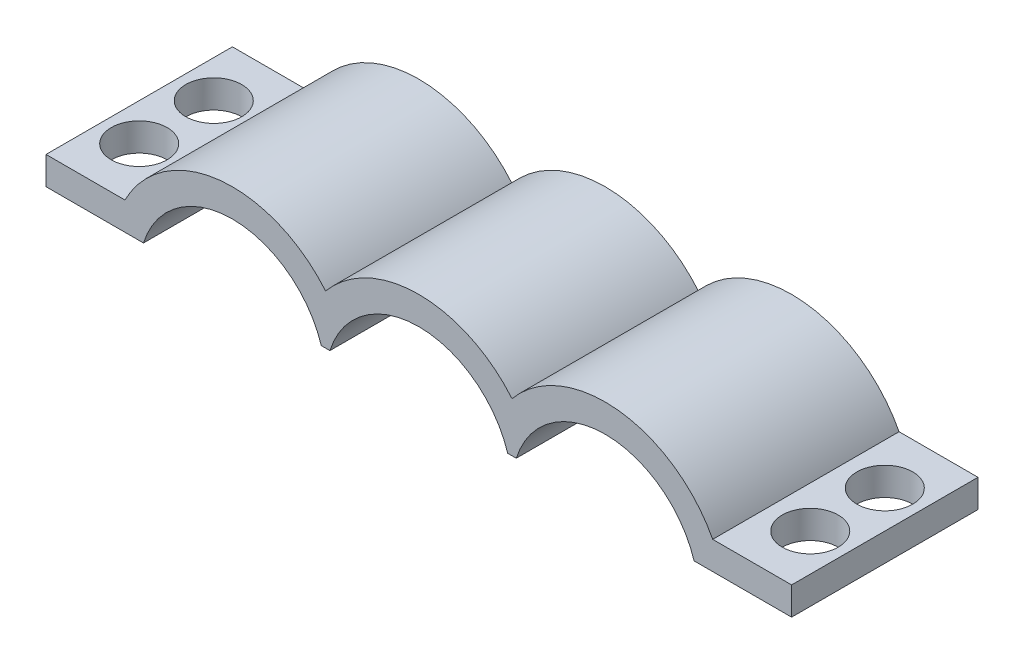
ISO-10303-21;
HEADER;
FILE_DESCRIPTION(('STEP AP214'),'2;1');
FILE_NAME('part.step','',(''),(''),'','','');
FILE_SCHEMA(('AUTOMOTIVE_DESIGN { 1 0 10303 214 1 1 1 1 }'));
ENDSEC;
DATA;
#1=APPLICATION_CONTEXT('core data for automotive mechanical design processes');
#2=APPLICATION_PROTOCOL_DEFINITION('international standard','automotive_design',2000,#1);
#3=PRODUCT_CONTEXT('',#1,'mechanical');
#4=PRODUCT('Part','Part','',(#3));
#5=PRODUCT_RELATED_PRODUCT_CATEGORY('part','',(#4));
#6=PRODUCT_DEFINITION_FORMATION('','',#4);
#7=PRODUCT_DEFINITION_CONTEXT('part definition',#1,'design');
#8=PRODUCT_DEFINITION('design','',#6,#7);
#9=PRODUCT_DEFINITION_SHAPE('','',#8);
#10=(LENGTH_UNIT() NAMED_UNIT(*) SI_UNIT(.MILLI.,.METRE.));
#11=(NAMED_UNIT(*) PLANE_ANGLE_UNIT() SI_UNIT($,.RADIAN.));
#12=(NAMED_UNIT(*) SI_UNIT($,.STERADIAN.) SOLID_ANGLE_UNIT());
#13=UNCERTAINTY_MEASURE_WITH_UNIT(LENGTH_MEASURE(1.E-05),#10,'distance_accuracy_value','');
#14=(GEOMETRIC_REPRESENTATION_CONTEXT(3) GLOBAL_UNCERTAINTY_ASSIGNED_CONTEXT((#13)) GLOBAL_UNIT_ASSIGNED_CONTEXT((#10,
#11,#12)) REPRESENTATION_CONTEXT('',''));
#15=CARTESIAN_POINT('',(0.,0.,0.));
#16=DIRECTION('',(0.,0.,1.));
#17=DIRECTION('',(1.,0.,0.));
#18=AXIS2_PLACEMENT_3D('',#15,#16,#17);
#19=CARTESIAN_POINT('',(20.,3.,10.));
#20=DIRECTION('',(0.,-1.,0.));
#21=DIRECTION('',(0.,0.,-1.));
#22=AXIS2_PLACEMENT_3D('',#19,#20,#21);
#23=PLANE('',#22);
#24=CARTESIAN_POINT('',(18.,3.,2.99999999999978));
#25=DIRECTION('',(0.,1.,0.));
#26=DIRECTION('',(0.,0.,-1.));
#27=AXIS2_PLACEMENT_3D('',#24,#25,#26);
#28=CIRCLE('',#27,1.5);
#29=CARTESIAN_POINT('',(18.,3.,1.49999999999978));
#30=VERTEX_POINT('',#29);
#31=EDGE_CURVE('E268',#30,#30,#28,.T.);
#32=ORIENTED_EDGE('',*,*,#31,.F.);
#33=EDGE_LOOP('',(#32));
#34=FACE_BOUND('',#33,.T.);
#35=CARTESIAN_POINT('',(18.,3.,6.99999999999978));
#36=DIRECTION('',(0.,1.,0.));
#37=DIRECTION('',(0.,0.,1.));
#38=AXIS2_PLACEMENT_3D('',#35,#36,#37);
#39=CIRCLE('',#38,1.49999999999999);
#40=CARTESIAN_POINT('',(18.,3.,8.49999999999977));
#41=VERTEX_POINT('',#40);
#42=EDGE_CURVE('E272',#41,#41,#39,.T.);
#43=ORIENTED_EDGE('',*,*,#42,.F.);
#44=EDGE_LOOP('',(#43));
#45=FACE_BOUND('',#44,.T.);
#46=DIRECTION('',(-1.,0.,0.));
#47=VECTOR('',#46,1.);
#48=CARTESIAN_POINT('',(20.,3.,0.));
#49=LINE('',#48,#47);
#50=CARTESIAN_POINT('',(20.,3.,0.));
#51=VERTEX_POINT('',#50);
#52=CARTESIAN_POINT('',(15.7662812973354,3.,0.));
#53=VERTEX_POINT('',#52);
#54=EDGE_CURVE('E174',#51,#53,#49,.T.);
#55=ORIENTED_EDGE('',*,*,#54,.T.);
#56=DIRECTION('',(0.,0.,-1.));
#57=VECTOR('',#56,1.);
#58=CARTESIAN_POINT('',(15.7662812973354,3.,10.));
#59=LINE('',#58,#57);
#60=CARTESIAN_POINT('',(15.7662812973354,3.,10.));
#61=VERTEX_POINT('',#60);
#62=EDGE_CURVE('E11',#61,#53,#59,.T.);
#63=ORIENTED_EDGE('',*,*,#62,.F.);
#64=DIRECTION('',(-1.,0.,0.));
#65=VECTOR('',#64,1.);
#66=CARTESIAN_POINT('',(20.,3.,10.));
#67=LINE('',#66,#65);
#68=CARTESIAN_POINT('',(20.,3.,10.));
#69=VERTEX_POINT('',#68);
#70=EDGE_CURVE('E200',#69,#61,#67,.T.);
#71=ORIENTED_EDGE('',*,*,#70,.F.);
#72=DIRECTION('',(0.,0.,-1.));
#73=VECTOR('',#72,1.);
#74=CARTESIAN_POINT('',(20.,3.,10.));
#75=LINE('',#74,#73);
#76=EDGE_CURVE('E170',#69,#51,#75,.T.);
#77=ORIENTED_EDGE('',*,*,#76,.T.);
#78=EDGE_LOOP('',(#55,#63,#71,#77));
#79=FACE_BOUND('',#78,.T.);
#80=ADVANCED_FACE('F40',(#34,#45,#79),#23,.F.);
#81=CARTESIAN_POINT('',(10.,0.,10.));
#82=DIRECTION('',(0.,0.,-1.));
#83=DIRECTION('',(-1.,0.,0.));
#84=AXIS2_PLACEMENT_3D('',#81,#82,#83);
#85=CYLINDRICAL_SURFACE('',#84,6.49999999999999);
#86=CARTESIAN_POINT('',(10.,0.,0.));
#87=DIRECTION('',(0.,0.,1.));
#88=DIRECTION('',(1.,0.,0.));
#89=AXIS2_PLACEMENT_3D('',#86,#87,#88);
#90=CIRCLE('',#89,6.49999999999999);
#91=CARTESIAN_POINT('',(5.,4.15331193145904,0.));
#92=VERTEX_POINT('',#91);
#93=EDGE_CURVE('E177',#53,#92,#90,.T.);
#94=ORIENTED_EDGE('',*,*,#93,.T.);
#95=DIRECTION('',(0.,0.,-1.));
#96=VECTOR('',#95,1.);
#97=CARTESIAN_POINT('',(5.,4.15331193145904,10.));
#98=LINE('',#97,#96);
#99=CARTESIAN_POINT('',(5.,4.15331193145904,10.));
#100=VERTEX_POINT('',#99);
#101=EDGE_CURVE('E49',#100,#92,#98,.T.);
#102=ORIENTED_EDGE('',*,*,#101,.F.);
#103=CARTESIAN_POINT('',(10.,0.,10.));
#104=DIRECTION('',(0.,0.,1.));
#105=DIRECTION('',(1.,0.,0.));
#106=AXIS2_PLACEMENT_3D('',#103,#104,#105);
#107=CIRCLE('',#106,6.49999999999999);
#108=EDGE_CURVE('E119',#61,#100,#107,.T.);
#109=ORIENTED_EDGE('',*,*,#108,.F.);
#110=ORIENTED_EDGE('',*,*,#62,.T.);
#111=EDGE_LOOP('',(#94,#102,#109,#110));
#112=FACE_BOUND('',#111,.T.);
#113=ADVANCED_FACE('F259',(#112),#85,.T.);
#114=CARTESIAN_POINT('',(0.,0.,10.));
#115=DIRECTION('',(0.,0.,-1.));
#116=DIRECTION('',(-1.,0.,0.));
#117=AXIS2_PLACEMENT_3D('',#114,#115,#116);
#118=CYLINDRICAL_SURFACE('',#117,6.5);
#119=CARTESIAN_POINT('',(0.,0.,0.));
#120=DIRECTION('',(0.,0.,1.));
#121=DIRECTION('',(1.,0.,0.));
#122=AXIS2_PLACEMENT_3D('',#119,#120,#121);
#123=CIRCLE('',#122,6.5);
#124=CARTESIAN_POINT('',(-5.,4.15331193145904,0.));
#125=VERTEX_POINT('',#124);
#126=EDGE_CURVE('E179',#92,#125,#123,.T.);
#127=ORIENTED_EDGE('',*,*,#126,.T.);
#128=DIRECTION('',(0.,0.,-1.));
#129=VECTOR('',#128,1.);
#130=CARTESIAN_POINT('',(-5.,4.15331193145904,10.));
#131=LINE('',#130,#129);
#132=CARTESIAN_POINT('',(-5.,4.15331193145904,10.));
#133=VERTEX_POINT('',#132);
#134=EDGE_CURVE('E225',#133,#125,#131,.T.);
#135=ORIENTED_EDGE('',*,*,#134,.F.);
#136=CARTESIAN_POINT('',(0.,0.,10.));
#137=DIRECTION('',(0.,0.,1.));
#138=DIRECTION('',(1.,0.,0.));
#139=AXIS2_PLACEMENT_3D('',#136,#137,#138);
#140=CIRCLE('',#139,6.5);
#141=EDGE_CURVE('E283',#100,#133,#140,.T.);
#142=ORIENTED_EDGE('',*,*,#141,.F.);
#143=ORIENTED_EDGE('',*,*,#101,.T.);
#144=EDGE_LOOP('',(#127,#135,#142,#143));
#145=FACE_BOUND('',#144,.T.);
#146=ADVANCED_FACE('F264',(#145),#118,.T.);
#147=CARTESIAN_POINT('',(-10.,0.,10.));
#148=DIRECTION('',(0.,0.,-1.));
#149=DIRECTION('',(-1.,0.,0.));
#150=AXIS2_PLACEMENT_3D('',#147,#148,#149);
#151=CYLINDRICAL_SURFACE('',#150,6.5);
#152=CARTESIAN_POINT('',(-10.,0.,0.));
#153=DIRECTION('',(0.,0.,1.));
#154=DIRECTION('',(1.,0.,0.));
#155=AXIS2_PLACEMENT_3D('',#152,#153,#154);
#156=CIRCLE('',#155,6.5);
#157=CARTESIAN_POINT('',(-15.7662812973354,3.,0.));
#158=VERTEX_POINT('',#157);
#159=EDGE_CURVE('E181',#125,#158,#156,.T.);
#160=ORIENTED_EDGE('',*,*,#159,.T.);
#161=DIRECTION('',(0.,0.,-1.));
#162=VECTOR('',#161,1.);
#163=CARTESIAN_POINT('',(-15.7662812973354,3.,10.));
#164=LINE('',#163,#162);
#165=CARTESIAN_POINT('',(-15.7662812973354,3.,10.));
#166=VERTEX_POINT('',#165);
#167=EDGE_CURVE('E222',#166,#158,#164,.T.);
#168=ORIENTED_EDGE('',*,*,#167,.F.);
#169=CARTESIAN_POINT('',(-10.,0.,10.));
#170=DIRECTION('',(0.,0.,1.));
#171=DIRECTION('',(1.,0.,0.));
#172=AXIS2_PLACEMENT_3D('',#169,#170,#171);
#173=CIRCLE('',#172,6.5);
#174=EDGE_CURVE('E285',#133,#166,#173,.T.);
#175=ORIENTED_EDGE('',*,*,#174,.F.);
#176=ORIENTED_EDGE('',*,*,#134,.T.);
#177=EDGE_LOOP('',(#160,#168,#175,#176));
#178=FACE_BOUND('',#177,.T.);
#179=ADVANCED_FACE('F336',(#178),#151,.T.);
#180=CARTESIAN_POINT('',(-20.,3.,10.));
#181=DIRECTION('',(0.,-1.,0.));
#182=DIRECTION('',(0.,0.,-1.));
#183=AXIS2_PLACEMENT_3D('',#180,#181,#182);
#184=PLANE('',#183);
#185=CARTESIAN_POINT('',(-18.,3.,7.));
#186=DIRECTION('',(0.,1.,0.));
#187=DIRECTION('',(0.,0.,-1.));
#188=AXIS2_PLACEMENT_3D('',#185,#186,#187);
#189=CIRCLE('',#188,1.5);
#190=CARTESIAN_POINT('',(-18.,3.,5.5));
#191=VERTEX_POINT('',#190);
#192=EDGE_CURVE('E381',#191,#191,#189,.T.);
#193=ORIENTED_EDGE('',*,*,#192,.F.);
#194=EDGE_LOOP('',(#193));
#195=FACE_BOUND('',#194,.T.);
#196=CARTESIAN_POINT('',(-18.,3.,3.));
#197=DIRECTION('',(0.,1.,0.));
#198=DIRECTION('',(0.,0.,1.));
#199=AXIS2_PLACEMENT_3D('',#196,#197,#198);
#200=CIRCLE('',#199,1.5);
#201=CARTESIAN_POINT('',(-18.,3.,4.5));
#202=VERTEX_POINT('',#201);
#203=EDGE_CURVE('E234',#202,#202,#200,.T.);
#204=ORIENTED_EDGE('',*,*,#203,.F.);
#205=EDGE_LOOP('',(#204));
#206=FACE_BOUND('',#205,.T.);
#207=DIRECTION('',(-1.,0.,0.));
#208=VECTOR('',#207,1.);
#209=CARTESIAN_POINT('',(-20.,3.,0.));
#210=LINE('',#209,#208);
#211=CARTESIAN_POINT('',(-20.,3.,0.));
#212=VERTEX_POINT('',#211);
#213=EDGE_CURVE('E183',#158,#212,#210,.T.);
#214=ORIENTED_EDGE('',*,*,#213,.T.);
#215=DIRECTION('',(0.,0.,-1.));
#216=VECTOR('',#215,1.);
#217=CARTESIAN_POINT('',(-20.,3.,10.));
#218=LINE('',#217,#216);
#219=CARTESIAN_POINT('',(-20.,3.,10.));
#220=VERTEX_POINT('',#219);
#221=EDGE_CURVE('E219',#220,#212,#218,.T.);
#222=ORIENTED_EDGE('',*,*,#221,.F.);
#223=DIRECTION('',(-1.,0.,0.));
#224=VECTOR('',#223,1.);
#225=CARTESIAN_POINT('',(-20.,3.,10.));
#226=LINE('',#225,#224);
#227=EDGE_CURVE('E287',#166,#220,#226,.T.);
#228=ORIENTED_EDGE('',*,*,#227,.F.);
#229=ORIENTED_EDGE('',*,*,#167,.T.);
#230=EDGE_LOOP('',(#214,#222,#228,#229));
#231=FACE_BOUND('',#230,.T.);
#232=ADVANCED_FACE('F333',(#195,#206,#231),#184,.F.);
#233=CARTESIAN_POINT('',(-20.,1.5,10.));
#234=DIRECTION('',(1.,0.,0.));
#235=DIRECTION('',(0.,1.,0.));
#236=AXIS2_PLACEMENT_3D('',#233,#234,#235);
#237=PLANE('',#236);
#238=DIRECTION('',(0.,-1.,0.));
#239=VECTOR('',#238,1.);
#240=CARTESIAN_POINT('',(-20.,1.5,0.));
#241=LINE('',#240,#239);
#242=CARTESIAN_POINT('',(-20.,1.5,0.));
#243=VERTEX_POINT('',#242);
#244=EDGE_CURVE('E185',#212,#243,#241,.T.);
#245=ORIENTED_EDGE('',*,*,#244,.T.);
#246=DIRECTION('',(0.,0.,-1.));
#247=VECTOR('',#246,1.);
#248=CARTESIAN_POINT('',(-20.,1.5,10.));
#249=LINE('',#248,#247);
#250=CARTESIAN_POINT('',(-20.,1.5,10.));
#251=VERTEX_POINT('',#250);
#252=EDGE_CURVE('E216',#251,#243,#249,.T.);
#253=ORIENTED_EDGE('',*,*,#252,.F.);
#254=DIRECTION('',(0.,-1.,0.));
#255=VECTOR('',#254,1.);
#256=CARTESIAN_POINT('',(-20.,1.5,10.));
#257=LINE('',#256,#255);
#258=EDGE_CURVE('E293',#220,#251,#257,.T.);
#259=ORIENTED_EDGE('',*,*,#258,.F.);
#260=ORIENTED_EDGE('',*,*,#221,.T.);
#261=EDGE_LOOP('',(#245,#253,#259,#260));
#262=FACE_BOUND('',#261,.T.);
#263=ADVANCED_FACE('F328',(#262),#237,.F.);
#264=CARTESIAN_POINT('',(-14.7696960070847,1.5,10.));
#265=DIRECTION('',(0.,1.,0.));
#266=DIRECTION('',(-1.,0.,0.));
#267=AXIS2_PLACEMENT_3D('',#264,#265,#266);
#268=PLANE('',#267);
#269=CARTESIAN_POINT('',(-18.,1.5,7.));
#270=DIRECTION('',(0.,1.,0.));
#271=DIRECTION('',(-1.,0.,0.));
#272=AXIS2_PLACEMENT_3D('',#269,#270,#271);
#273=CIRCLE('',#272,1.5);
#274=CARTESIAN_POINT('',(-19.5,1.5,7.));
#275=VERTEX_POINT('',#274);
#276=EDGE_CURVE('E43',#275,#275,#273,.T.);
#277=ORIENTED_EDGE('',*,*,#276,.T.);
#278=EDGE_LOOP('',(#277));
#279=FACE_BOUND('',#278,.T.);
#280=CARTESIAN_POINT('',(-18.,1.5,3.));
#281=DIRECTION('',(0.,1.,0.));
#282=DIRECTION('',(-1.,0.,0.));
#283=AXIS2_PLACEMENT_3D('',#280,#281,#282);
#284=CIRCLE('',#283,1.5);
#285=CARTESIAN_POINT('',(-19.5,1.5,3.));
#286=VERTEX_POINT('',#285);
#287=EDGE_CURVE('E236',#286,#286,#284,.T.);
#288=ORIENTED_EDGE('',*,*,#287,.T.);
#289=EDGE_LOOP('',(#288));
#290=FACE_BOUND('',#289,.T.);
#291=DIRECTION('',(1.,0.,0.));
#292=VECTOR('',#291,1.);
#293=CARTESIAN_POINT('',(-14.7696960070847,1.5,0.));
#294=LINE('',#293,#292);
#295=CARTESIAN_POINT('',(-14.7696960070847,1.5,0.));
#296=VERTEX_POINT('',#295);
#297=EDGE_CURVE('E187',#243,#296,#294,.T.);
#298=ORIENTED_EDGE('',*,*,#297,.T.);
#299=DIRECTION('',(0.,0.,-1.));
#300=VECTOR('',#299,1.);
#301=CARTESIAN_POINT('',(-14.7696960070847,1.5,10.));
#302=LINE('',#301,#300);
#303=CARTESIAN_POINT('',(-14.7696960070847,1.5,10.));
#304=VERTEX_POINT('',#303);
#305=EDGE_CURVE('E213',#304,#296,#302,.T.);
#306=ORIENTED_EDGE('',*,*,#305,.F.);
#307=DIRECTION('',(1.,0.,0.));
#308=VECTOR('',#307,1.);
#309=CARTESIAN_POINT('',(-14.7696960070847,1.5,10.));
#310=LINE('',#309,#308);
#311=EDGE_CURVE('E295',#251,#304,#310,.T.);
#312=ORIENTED_EDGE('',*,*,#311,.F.);
#313=ORIENTED_EDGE('',*,*,#252,.T.);
#314=EDGE_LOOP('',(#298,#306,#312,#313));
#315=FACE_BOUND('',#314,.T.);
#316=ADVANCED_FACE('F243',(#279,#290,#315),#268,.F.);
#317=CARTESIAN_POINT('',(-10.,0.,10.));
#318=DIRECTION('',(0.,0.,-1.));
#319=DIRECTION('',(-1.,0.,0.));
#320=AXIS2_PLACEMENT_3D('',#317,#318,#319);
#321=CYLINDRICAL_SURFACE('',#320,5.);
#322=CARTESIAN_POINT('',(-10.,0.,0.));
#323=DIRECTION('',(0.,0.,-1.));
#324=DIRECTION('',(1.,0.,0.));
#325=AXIS2_PLACEMENT_3D('',#322,#323,#324);
#326=CIRCLE('',#325,5.);
#327=CARTESIAN_POINT('',(-5.23030399291527,1.5,0.));
#328=VERTEX_POINT('',#327);
#329=EDGE_CURVE('E189',#296,#328,#326,.T.);
#330=ORIENTED_EDGE('',*,*,#329,.T.);
#331=DIRECTION('',(0.,0.,-1.));
#332=VECTOR('',#331,1.);
#333=CARTESIAN_POINT('',(-5.23030399291527,1.5,10.));
#334=LINE('',#333,#332);
#335=CARTESIAN_POINT('',(-5.23030399291527,1.5,10.));
#336=VERTEX_POINT('',#335);
#337=EDGE_CURVE('E210',#336,#328,#334,.T.);
#338=ORIENTED_EDGE('',*,*,#337,.F.);
#339=CARTESIAN_POINT('',(-10.,0.,10.));
#340=DIRECTION('',(0.,0.,-1.));
#341=DIRECTION('',(1.,0.,0.));
#342=AXIS2_PLACEMENT_3D('',#339,#340,#341);
#343=CIRCLE('',#342,5.);
#344=EDGE_CURVE('E297',#304,#336,#343,.T.);
#345=ORIENTED_EDGE('',*,*,#344,.F.);
#346=ORIENTED_EDGE('',*,*,#305,.T.);
#347=EDGE_LOOP('',(#330,#338,#345,#346));
#348=FACE_BOUND('',#347,.T.);
#349=ADVANCED_FACE('F320',(#348),#321,.F.);
#350=CARTESIAN_POINT('',(-4.76969600708473,1.5,10.));
#351=DIRECTION('',(0.,1.,0.));
#352=DIRECTION('',(0.,0.,1.));
#353=AXIS2_PLACEMENT_3D('',#350,#351,#352);
#354=PLANE('',#353);
#355=DIRECTION('',(1.,0.,0.));
#356=VECTOR('',#355,1.);
#357=CARTESIAN_POINT('',(-4.76969600708473,1.5,0.));
#358=LINE('',#357,#356);
#359=CARTESIAN_POINT('',(-4.76969600708473,1.5,0.));
#360=VERTEX_POINT('',#359);
#361=EDGE_CURVE('E191',#328,#360,#358,.T.);
#362=ORIENTED_EDGE('',*,*,#361,.T.);
#363=DIRECTION('',(0.,0.,-1.));
#364=VECTOR('',#363,1.);
#365=CARTESIAN_POINT('',(-4.76969600708473,1.5,10.));
#366=LINE('',#365,#364);
#367=CARTESIAN_POINT('',(-4.76969600708473,1.5,10.));
#368=VERTEX_POINT('',#367);
#369=EDGE_CURVE('E207',#368,#360,#366,.T.);
#370=ORIENTED_EDGE('',*,*,#369,.F.);
#371=DIRECTION('',(1.,0.,0.));
#372=VECTOR('',#371,1.);
#373=CARTESIAN_POINT('',(-4.76969600708473,1.5,10.));
#374=LINE('',#373,#372);
#375=EDGE_CURVE('E299',#336,#368,#374,.T.);
#376=ORIENTED_EDGE('',*,*,#375,.F.);
#377=ORIENTED_EDGE('',*,*,#337,.T.);
#378=EDGE_LOOP('',(#362,#370,#376,#377));
#379=FACE_BOUND('',#378,.T.);
#380=ADVANCED_FACE('F316',(#379),#354,.F.);
#381=CARTESIAN_POINT('',(0.,0.,10.));
#382=DIRECTION('',(0.,0.,-1.));
#383=DIRECTION('',(-1.,0.,0.));
#384=AXIS2_PLACEMENT_3D('',#381,#382,#383);
#385=CYLINDRICAL_SURFACE('',#384,5.);
#386=CARTESIAN_POINT('',(0.,0.,0.));
#387=DIRECTION('',(0.,0.,-1.));
#388=DIRECTION('',(1.,0.,0.));
#389=AXIS2_PLACEMENT_3D('',#386,#387,#388);
#390=CIRCLE('',#389,5.);
#391=CARTESIAN_POINT('',(4.76969600708473,1.5,0.));
#392=VERTEX_POINT('',#391);
#393=EDGE_CURVE('E193',#360,#392,#390,.T.);
#394=ORIENTED_EDGE('',*,*,#393,.T.);
#395=DIRECTION('',(0.,0.,-1.));
#396=VECTOR('',#395,1.);
#397=CARTESIAN_POINT('',(4.76969600708473,1.5,10.));
#398=LINE('',#397,#396);
#399=CARTESIAN_POINT('',(4.76969600708473,1.5,10.));
#400=VERTEX_POINT('',#399);
#401=EDGE_CURVE('E204',#400,#392,#398,.T.);
#402=ORIENTED_EDGE('',*,*,#401,.F.);
#403=CARTESIAN_POINT('',(0.,0.,10.));
#404=DIRECTION('',(0.,0.,-1.));
#405=DIRECTION('',(1.,0.,0.));
#406=AXIS2_PLACEMENT_3D('',#403,#404,#405);
#407=CIRCLE('',#406,5.);
#408=EDGE_CURVE('E301',#368,#400,#407,.T.);
#409=ORIENTED_EDGE('',*,*,#408,.F.);
#410=ORIENTED_EDGE('',*,*,#369,.T.);
#411=EDGE_LOOP('',(#394,#402,#409,#410));
#412=FACE_BOUND('',#411,.T.);
#413=ADVANCED_FACE('F307',(#412),#385,.F.);
#414=CARTESIAN_POINT('',(5.23030399291527,1.5,10.));
#415=DIRECTION('',(0.,1.,0.));
#416=DIRECTION('',(0.,0.,1.));
#417=AXIS2_PLACEMENT_3D('',#414,#415,#416);
#418=PLANE('',#417);
#419=DIRECTION('',(1.,0.,0.));
#420=VECTOR('',#419,1.);
#421=CARTESIAN_POINT('',(5.23030399291527,1.5,0.));
#422=LINE('',#421,#420);
#423=CARTESIAN_POINT('',(5.23030399291527,1.5,0.));
#424=VERTEX_POINT('',#423);
#425=EDGE_CURVE('E195',#392,#424,#422,.T.);
#426=ORIENTED_EDGE('',*,*,#425,.T.);
#427=DIRECTION('',(0.,0.,-1.));
#428=VECTOR('',#427,1.);
#429=CARTESIAN_POINT('',(5.23030399291527,1.5,10.));
#430=LINE('',#429,#428);
#431=CARTESIAN_POINT('',(5.23030399291527,1.5,10.));
#432=VERTEX_POINT('',#431);
#433=EDGE_CURVE('E165',#432,#424,#430,.T.);
#434=ORIENTED_EDGE('',*,*,#433,.F.);
#435=DIRECTION('',(1.,0.,0.));
#436=VECTOR('',#435,1.);
#437=CARTESIAN_POINT('',(5.23030399291527,1.5,10.));
#438=LINE('',#437,#436);
#439=EDGE_CURVE('E156',#400,#432,#438,.T.);
#440=ORIENTED_EDGE('',*,*,#439,.F.);
#441=ORIENTED_EDGE('',*,*,#401,.T.);
#442=EDGE_LOOP('',(#426,#434,#440,#441));
#443=FACE_BOUND('',#442,.T.);
#444=ADVANCED_FACE('F311',(#443),#418,.F.);
#445=CARTESIAN_POINT('',(10.,0.,10.));
#446=DIRECTION('',(0.,0.,-1.));
#447=DIRECTION('',(-1.,0.,0.));
#448=AXIS2_PLACEMENT_3D('',#445,#446,#447);
#449=CYLINDRICAL_SURFACE('',#448,5.);
#450=CARTESIAN_POINT('',(10.,0.,0.));
#451=DIRECTION('',(0.,0.,-1.));
#452=DIRECTION('',(1.,0.,0.));
#453=AXIS2_PLACEMENT_3D('',#450,#451,#452);
#454=CIRCLE('',#453,5.);
#455=CARTESIAN_POINT('',(14.7696960070847,1.5,0.));
#456=VERTEX_POINT('',#455);
#457=EDGE_CURVE('E164',#424,#456,#454,.T.);
#458=ORIENTED_EDGE('',*,*,#457,.T.);
#459=DIRECTION('',(0.,0.,-1.));
#460=VECTOR('',#459,1.);
#461=CARTESIAN_POINT('',(14.7696960070847,1.5,10.));
#462=LINE('',#461,#460);
#463=CARTESIAN_POINT('',(14.7696960070847,1.5,10.));
#464=VERTEX_POINT('',#463);
#465=EDGE_CURVE('E161',#464,#456,#462,.T.);
#466=ORIENTED_EDGE('',*,*,#465,.F.);
#467=CARTESIAN_POINT('',(10.,0.,10.));
#468=DIRECTION('',(0.,0.,-1.));
#469=DIRECTION('',(1.,0.,0.));
#470=AXIS2_PLACEMENT_3D('',#467,#468,#469);
#471=CIRCLE('',#470,5.);
#472=EDGE_CURVE('E150',#432,#464,#471,.T.);
#473=ORIENTED_EDGE('',*,*,#472,.F.);
#474=ORIENTED_EDGE('',*,*,#433,.T.);
#475=EDGE_LOOP('',(#458,#466,#473,#474));
#476=FACE_BOUND('',#475,.T.);
#477=ADVANCED_FACE('F162',(#476),#449,.F.);
#478=CARTESIAN_POINT('',(20.,1.5,10.));
#479=DIRECTION('',(0.,1.,0.));
#480=DIRECTION('',(-1.,0.,0.));
#481=AXIS2_PLACEMENT_3D('',#478,#479,#480);
#482=PLANE('',#481);
#483=CARTESIAN_POINT('',(18.,1.5,2.99999999999978));
#484=DIRECTION('',(0.,1.,0.));
#485=DIRECTION('',(-1.,0.,0.));
#486=AXIS2_PLACEMENT_3D('',#483,#484,#485);
#487=CIRCLE('',#486,1.5);
#488=CARTESIAN_POINT('',(16.5,1.5,2.99999999999978));
#489=VERTEX_POINT('',#488);
#490=EDGE_CURVE('E233',#489,#489,#487,.T.);
#491=ORIENTED_EDGE('',*,*,#490,.T.);
#492=EDGE_LOOP('',(#491));
#493=FACE_BOUND('',#492,.T.);
#494=CARTESIAN_POINT('',(18.,1.5,6.99999999999978));
#495=DIRECTION('',(0.,1.,0.));
#496=DIRECTION('',(-1.,0.,0.));
#497=AXIS2_PLACEMENT_3D('',#494,#495,#496);
#498=CIRCLE('',#497,1.49999999999999);
#499=CARTESIAN_POINT('',(16.5000000000001,1.5,6.99999999999978));
#500=VERTEX_POINT('',#499);
#501=EDGE_CURVE('E230',#500,#500,#498,.T.);
#502=ORIENTED_EDGE('',*,*,#501,.T.);
#503=EDGE_LOOP('',(#502));
#504=FACE_BOUND('',#503,.T.);
#505=DIRECTION('',(1.,0.,0.));
#506=VECTOR('',#505,1.);
#507=CARTESIAN_POINT('',(20.,1.5,0.));
#508=LINE('',#507,#506);
#509=CARTESIAN_POINT('',(20.,1.5,0.));
#510=VERTEX_POINT('',#509);
#511=EDGE_CURVE('E105',#456,#510,#508,.T.);
#512=ORIENTED_EDGE('',*,*,#511,.T.);
#513=DIRECTION('',(0.,0.,-1.));
#514=VECTOR('',#513,1.);
#515=CARTESIAN_POINT('',(20.,1.5,10.));
#516=LINE('',#515,#514);
#517=CARTESIAN_POINT('',(20.,1.5,10.));
#518=VERTEX_POINT('',#517);
#519=EDGE_CURVE('E166',#518,#510,#516,.T.);
#520=ORIENTED_EDGE('',*,*,#519,.F.);
#521=DIRECTION('',(1.,0.,0.));
#522=VECTOR('',#521,1.);
#523=CARTESIAN_POINT('',(20.,1.5,10.));
#524=LINE('',#523,#522);
#525=EDGE_CURVE('E154',#464,#518,#524,.T.);
#526=ORIENTED_EDGE('',*,*,#525,.F.);
#527=ORIENTED_EDGE('',*,*,#465,.T.);
#528=EDGE_LOOP('',(#512,#520,#526,#527));
#529=FACE_BOUND('',#528,.T.);
#530=ADVANCED_FACE('F168',(#493,#504,#529),#482,.F.);
#531=CARTESIAN_POINT('',(20.,1.5,10.));
#532=DIRECTION('',(-1.,0.,0.));
#533=DIRECTION('',(0.,-1.,0.));
#534=AXIS2_PLACEMENT_3D('',#531,#532,#533);
#535=PLANE('',#534);
#536=DIRECTION('',(0.,1.,0.));
#537=VECTOR('',#536,1.);
#538=CARTESIAN_POINT('',(20.,1.5,0.));
#539=LINE('',#538,#537);
#540=EDGE_CURVE('E111',#510,#51,#539,.T.);
#541=ORIENTED_EDGE('',*,*,#540,.T.);
#542=ORIENTED_EDGE('',*,*,#76,.F.);
#543=DIRECTION('',(0.,1.,0.));
#544=VECTOR('',#543,1.);
#545=CARTESIAN_POINT('',(20.,1.5,10.));
#546=LINE('',#545,#544);
#547=EDGE_CURVE('E58',#518,#69,#546,.T.);
#548=ORIENTED_EDGE('',*,*,#547,.F.);
#549=ORIENTED_EDGE('',*,*,#519,.T.);
#550=EDGE_LOOP('',(#541,#542,#548,#549));
#551=FACE_BOUND('',#550,.T.);
#552=ADVANCED_FACE('F363',(#551),#535,.F.);
#553=CARTESIAN_POINT('',(10.,0.,10.));
#554=DIRECTION('',(0.,0.,1.));
#555=DIRECTION('',(1.,0.,0.));
#556=AXIS2_PLACEMENT_3D('',#553,#554,#555);
#557=PLANE('',#556);
#558=ORIENTED_EDGE('',*,*,#70,.T.);
#559=ORIENTED_EDGE('',*,*,#108,.T.);
#560=ORIENTED_EDGE('',*,*,#141,.T.);
#561=ORIENTED_EDGE('',*,*,#174,.T.);
#562=ORIENTED_EDGE('',*,*,#227,.T.);
#563=ORIENTED_EDGE('',*,*,#258,.T.);
#564=ORIENTED_EDGE('',*,*,#311,.T.);
#565=ORIENTED_EDGE('',*,*,#344,.T.);
#566=ORIENTED_EDGE('',*,*,#375,.T.);
#567=ORIENTED_EDGE('',*,*,#408,.T.);
#568=ORIENTED_EDGE('',*,*,#439,.T.);
#569=ORIENTED_EDGE('',*,*,#472,.T.);
#570=ORIENTED_EDGE('',*,*,#525,.T.);
#571=ORIENTED_EDGE('',*,*,#547,.T.);
#572=EDGE_LOOP('',(#558,#559,#560,#561,#562,#563,#564,#565,#566,#567,#568,#569,#570,#571));
#573=FACE_BOUND('',#572,.T.);
#574=ADVANCED_FACE('F152',(#573),#557,.T.);
#575=CARTESIAN_POINT('',(10.,0.,0.));
#576=DIRECTION('',(0.,0.,1.));
#577=DIRECTION('',(1.,0.,0.));
#578=AXIS2_PLACEMENT_3D('',#575,#576,#577);
#579=PLANE('',#578);
#580=ORIENTED_EDGE('',*,*,#54,.F.);
#581=ORIENTED_EDGE('',*,*,#540,.F.);
#582=ORIENTED_EDGE('',*,*,#511,.F.);
#583=ORIENTED_EDGE('',*,*,#457,.F.);
#584=ORIENTED_EDGE('',*,*,#425,.F.);
#585=ORIENTED_EDGE('',*,*,#393,.F.);
#586=ORIENTED_EDGE('',*,*,#361,.F.);
#587=ORIENTED_EDGE('',*,*,#329,.F.);
#588=ORIENTED_EDGE('',*,*,#297,.F.);
#589=ORIENTED_EDGE('',*,*,#244,.F.);
#590=ORIENTED_EDGE('',*,*,#213,.F.);
#591=ORIENTED_EDGE('',*,*,#159,.F.);
#592=ORIENTED_EDGE('',*,*,#126,.F.);
#593=ORIENTED_EDGE('',*,*,#93,.F.);
#594=EDGE_LOOP('',(#580,#581,#582,#583,#584,#585,#586,#587,#588,#589,#590,#591,#592,#593));
#595=FACE_BOUND('',#594,.T.);
#596=ADVANCED_FACE('F277',(#595),#579,.F.);
#597=CARTESIAN_POINT('',(18.,-7.,6.99999999999978));
#598=DIRECTION('',(0.,1.,0.));
#599=DIRECTION('',(0.,0.,1.));
#600=AXIS2_PLACEMENT_3D('',#597,#598,#599);
#601=CYLINDRICAL_SURFACE('',#600,1.49999999999999);
#602=ORIENTED_EDGE('',*,*,#42,.T.);
#603=EDGE_LOOP('',(#602));
#604=FACE_BOUND('',#603,.T.);
#605=ORIENTED_EDGE('',*,*,#501,.F.);
#606=EDGE_LOOP('',(#605));
#607=FACE_BOUND('',#606,.T.);
#608=ADVANCED_FACE('F369',(#604,#607),#601,.F.);
#609=CARTESIAN_POINT('',(18.,-7.,2.99999999999978));
#610=DIRECTION('',(0.,1.,0.));
#611=DIRECTION('',(0.,0.,1.));
#612=AXIS2_PLACEMENT_3D('',#609,#610,#611);
#613=CYLINDRICAL_SURFACE('',#612,1.5);
#614=ORIENTED_EDGE('',*,*,#31,.T.);
#615=EDGE_LOOP('',(#614));
#616=FACE_BOUND('',#615,.T.);
#617=ORIENTED_EDGE('',*,*,#490,.F.);
#618=EDGE_LOOP('',(#617));
#619=FACE_BOUND('',#618,.T.);
#620=ADVANCED_FACE('F253',(#616,#619),#613,.F.);
#621=CARTESIAN_POINT('',(-18.,-7.,3.));
#622=DIRECTION('',(0.,1.,0.));
#623=DIRECTION('',(0.,0.,1.));
#624=AXIS2_PLACEMENT_3D('',#621,#622,#623);
#625=CYLINDRICAL_SURFACE('',#624,1.5);
#626=ORIENTED_EDGE('',*,*,#203,.T.);
#627=EDGE_LOOP('',(#626));
#628=FACE_BOUND('',#627,.T.);
#629=ORIENTED_EDGE('',*,*,#287,.F.);
#630=EDGE_LOOP('',(#629));
#631=FACE_BOUND('',#630,.T.);
#632=ADVANCED_FACE('F247',(#628,#631),#625,.F.);
#633=CARTESIAN_POINT('',(-18.,-7.,7.));
#634=DIRECTION('',(0.,1.,0.));
#635=DIRECTION('',(0.,0.,1.));
#636=AXIS2_PLACEMENT_3D('',#633,#634,#635);
#637=CYLINDRICAL_SURFACE('',#636,1.5);
#638=ORIENTED_EDGE('',*,*,#192,.T.);
#639=EDGE_LOOP('',(#638));
#640=FACE_BOUND('',#639,.T.);
#641=ORIENTED_EDGE('',*,*,#276,.F.);
#642=EDGE_LOOP('',(#641));
#643=FACE_BOUND('',#642,.T.);
#644=ADVANCED_FACE('F245',(#640,#643),#637,.F.);
#645=CLOSED_SHELL('',(#80,#113,#146,#179,#232,#263,#316,#349,#380,#413,#444,#477,#530,#552,#574,
#596,#608,#620,#632,#644));
#646=MANIFOLD_SOLID_BREP('B2',#645);
#647=ADVANCED_BREP_SHAPE_REPRESENTATION('',(#18,#646),#14);
#648=SHAPE_DEFINITION_REPRESENTATION(#9,#647);
ENDSEC;
END-ISO-10303-21;
